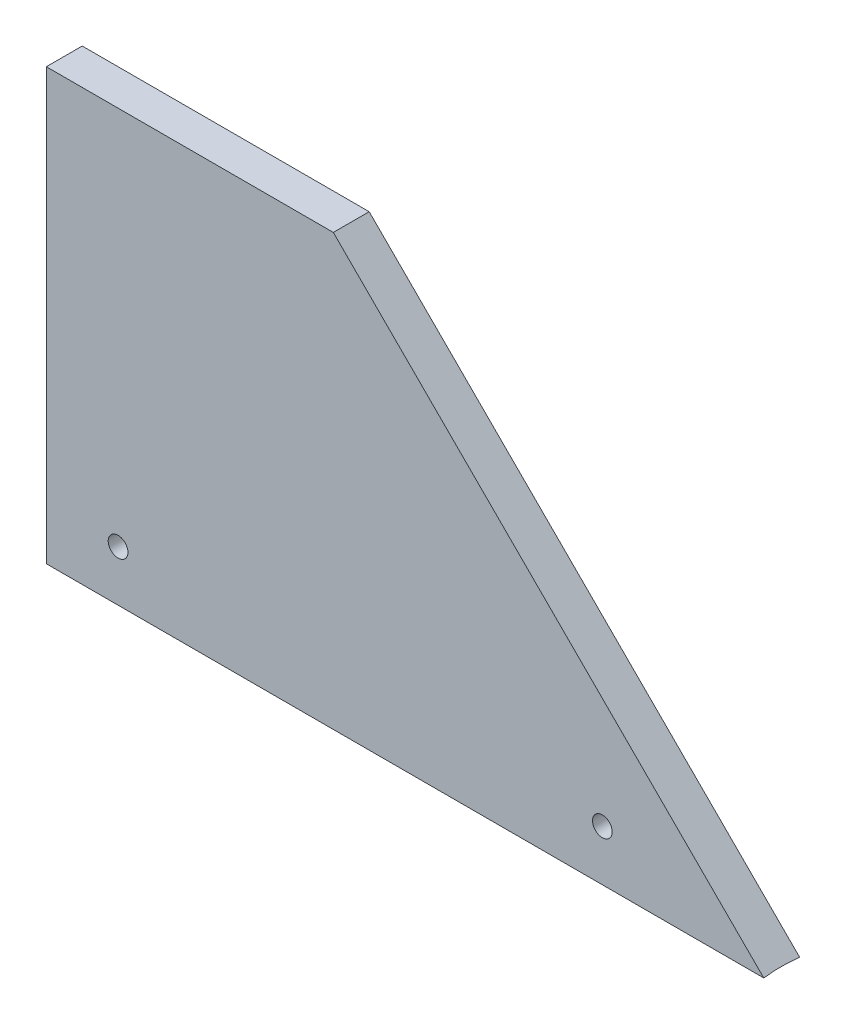
ISO-10303-21;
HEADER;
FILE_DESCRIPTION(('STEP AP214'),'2;1');
FILE_NAME('part.step','',(''),(''),'','','');
FILE_SCHEMA(('AUTOMOTIVE_DESIGN { 1 0 10303 214 1 1 1 1 }'));
ENDSEC;
DATA;
#1=APPLICATION_CONTEXT('core data for automotive mechanical design processes');
#2=APPLICATION_PROTOCOL_DEFINITION('international standard','automotive_design',2000,#1);
#3=PRODUCT_CONTEXT('',#1,'mechanical');
#4=PRODUCT('Part','Part','',(#3));
#5=PRODUCT_RELATED_PRODUCT_CATEGORY('part','',(#4));
#6=PRODUCT_DEFINITION_FORMATION('','',#4);
#7=PRODUCT_DEFINITION_CONTEXT('part definition',#1,'design');
#8=PRODUCT_DEFINITION('design','',#6,#7);
#9=PRODUCT_DEFINITION_SHAPE('','',#8);
#10=(LENGTH_UNIT() NAMED_UNIT(*) SI_UNIT(.MILLI.,.METRE.));
#11=(NAMED_UNIT(*) PLANE_ANGLE_UNIT() SI_UNIT($,.RADIAN.));
#12=(NAMED_UNIT(*) SI_UNIT($,.STERADIAN.) SOLID_ANGLE_UNIT());
#13=UNCERTAINTY_MEASURE_WITH_UNIT(LENGTH_MEASURE(1.E-05),#10,'distance_accuracy_value','');
#14=(GEOMETRIC_REPRESENTATION_CONTEXT(3) GLOBAL_UNCERTAINTY_ASSIGNED_CONTEXT((#13)) GLOBAL_UNIT_ASSIGNED_CONTEXT((#10,
#11,#12)) REPRESENTATION_CONTEXT('',''));
#15=CARTESIAN_POINT('',(0.,0.,0.));
#16=DIRECTION('',(0.,0.,1.));
#17=DIRECTION('',(1.,0.,0.));
#18=AXIS2_PLACEMENT_3D('',#15,#16,#17);
#19=CARTESIAN_POINT('',(80.,120.,10.));
#20=DIRECTION('',(-0.707106781186547,-0.707106781186548,0.));
#21=DIRECTION('',(0.707106781186548,-0.707106781186547,0.));
#22=AXIS2_PLACEMENT_3D('',#19,#20,#21);
#23=PLANE('',#22);
#24=CARTESIAN_POINT('',(276.035781050766,-76.0357810507658,5.));
#25=DIRECTION('',(-0.707106781186547,-0.707106781186548,0.));
#26=DIRECTION('',(0.707106781186548,-0.707106781186547,0.));
#27=AXIS2_PLACEMENT_3D('',#24,#25,#26);
#28=ELLIPSE('',#27,107.76307345283,76.2);
#29=CARTESIAN_POINT('',(200.,0.,0.));
#30=VERTEX_POINT('',#29);
#31=CARTESIAN_POINT('',(200.,0.,10.));
#32=VERTEX_POINT('',#31);
#33=EDGE_CURVE('E87',#30,#32,#28,.F.);
#34=ORIENTED_EDGE('',*,*,#33,.F.);
#35=DIRECTION('',(-0.707106781186547,0.707106781186547,0.));
#36=VECTOR('',#35,1.);
#37=CARTESIAN_POINT('',(80.,120.,0.));
#38=LINE('',#37,#36);
#39=CARTESIAN_POINT('',(80.,120.,0.));
#40=VERTEX_POINT('',#39);
#41=EDGE_CURVE('E81',#30,#40,#38,.T.);
#42=ORIENTED_EDGE('',*,*,#41,.T.);
#43=DIRECTION('',(0.,0.,-1.));
#44=VECTOR('',#43,1.);
#45=CARTESIAN_POINT('',(80.,120.,10.));
#46=LINE('',#45,#44);
#47=CARTESIAN_POINT('',(80.,120.,10.));
#48=VERTEX_POINT('',#47);
#49=EDGE_CURVE('E11',#48,#40,#46,.T.);
#50=ORIENTED_EDGE('',*,*,#49,.F.);
#51=DIRECTION('',(-0.707106781186547,0.707106781186547,0.));
#52=VECTOR('',#51,1.);
#53=CARTESIAN_POINT('',(80.,120.,10.));
#54=LINE('',#53,#52);
#55=EDGE_CURVE('E76',#32,#48,#54,.T.);
#56=ORIENTED_EDGE('',*,*,#55,.F.);
#57=EDGE_LOOP('',(#34,#42,#50,#56));
#58=FACE_BOUND('',#57,.T.);
#59=ADVANCED_FACE('F33',(#58),#23,.F.);
#60=CARTESIAN_POINT('',(0.,0.,10.));
#61=DIRECTION('',(1.,0.,0.));
#62=DIRECTION('',(0.,0.,-1.));
#63=AXIS2_PLACEMENT_3D('',#60,#61,#62);
#64=PLANE('',#63);
#65=CARTESIAN_POINT('',(0.,-76.0357810507658,5.));
#66=DIRECTION('',(1.,0.,0.));
#67=DIRECTION('',(0.,0.,-1.));
#68=AXIS2_PLACEMENT_3D('',#65,#66,#67);
#69=CIRCLE('',#68,76.2);
#70=CARTESIAN_POINT('',(0.,0.,10.));
#71=VERTEX_POINT('',#70);
#72=CARTESIAN_POINT('',(0.,0.,0.));
#73=VERTEX_POINT('',#72);
#74=EDGE_CURVE('E49',#71,#73,#69,.F.);
#75=ORIENTED_EDGE('',*,*,#74,.F.);
#76=DIRECTION('',(0.,-1.,0.));
#77=VECTOR('',#76,1.);
#78=CARTESIAN_POINT('',(0.,0.,10.));
#79=LINE('',#78,#77);
#80=CARTESIAN_POINT('',(0.,120.,10.));
#81=VERTEX_POINT('',#80);
#82=EDGE_CURVE('E94',#81,#71,#79,.T.);
#83=ORIENTED_EDGE('',*,*,#82,.F.);
#84=DIRECTION('',(0.,0.,-1.));
#85=VECTOR('',#84,1.);
#86=CARTESIAN_POINT('',(0.,120.,10.));
#87=LINE('',#86,#85);
#88=CARTESIAN_POINT('',(0.,120.,0.));
#89=VERTEX_POINT('',#88);
#90=EDGE_CURVE('E41',#81,#89,#87,.T.);
#91=ORIENTED_EDGE('',*,*,#90,.T.);
#92=DIRECTION('',(0.,-1.,0.));
#93=VECTOR('',#92,1.);
#94=CARTESIAN_POINT('',(0.,0.,0.));
#95=LINE('',#94,#93);
#96=EDGE_CURVE('E68',#89,#73,#95,.T.);
#97=ORIENTED_EDGE('',*,*,#96,.T.);
#98=EDGE_LOOP('',(#75,#83,#91,#97));
#99=FACE_BOUND('',#98,.T.);
#100=ADVANCED_FACE('F127',(#99),#64,.F.);
#101=CARTESIAN_POINT('',(0.,120.,10.));
#102=DIRECTION('',(0.,-1.,0.));
#103=DIRECTION('',(0.,0.,-1.));
#104=AXIS2_PLACEMENT_3D('',#101,#102,#103);
#105=PLANE('',#104);
#106=DIRECTION('',(-1.,0.,0.));
#107=VECTOR('',#106,1.);
#108=CARTESIAN_POINT('',(0.,120.,0.));
#109=LINE('',#108,#107);
#110=EDGE_CURVE('E64',#40,#89,#109,.T.);
#111=ORIENTED_EDGE('',*,*,#110,.T.);
#112=ORIENTED_EDGE('',*,*,#90,.F.);
#113=DIRECTION('',(-1.,0.,0.));
#114=VECTOR('',#113,1.);
#115=CARTESIAN_POINT('',(0.,120.,10.));
#116=LINE('',#115,#114);
#117=EDGE_CURVE('E99',#48,#81,#116,.T.);
#118=ORIENTED_EDGE('',*,*,#117,.F.);
#119=ORIENTED_EDGE('',*,*,#49,.T.);
#120=EDGE_LOOP('',(#111,#112,#118,#119));
#121=FACE_BOUND('',#120,.T.);
#122=ADVANCED_FACE('F124',(#121),#105,.F.);
#123=CARTESIAN_POINT('',(0.,0.,10.));
#124=DIRECTION('',(0.,0.,-1.));
#125=DIRECTION('',(-1.,0.,0.));
#126=AXIS2_PLACEMENT_3D('',#123,#124,#125);
#127=PLANE('',#126);
#128=CARTESIAN_POINT('',(155.,14.1238080805546,10.));
#129=DIRECTION('',(0.,0.,1.));
#130=DIRECTION('',(1.,0.,0.));
#131=AXIS2_PLACEMENT_3D('',#128,#129,#130);
#132=CIRCLE('',#131,2.75);
#133=CARTESIAN_POINT('',(157.75,14.1238080805546,10.));
#134=VERTEX_POINT('',#133);
#135=EDGE_CURVE('E115',#134,#134,#132,.T.);
#136=ORIENTED_EDGE('',*,*,#135,.F.);
#137=EDGE_LOOP('',(#136));
#138=FACE_BOUND('',#137,.T.);
#139=CARTESIAN_POINT('',(20.,14.1238080805546,10.));
#140=DIRECTION('',(0.,0.,1.));
#141=DIRECTION('',(1.,0.,0.));
#142=AXIS2_PLACEMENT_3D('',#139,#140,#141);
#143=CIRCLE('',#142,2.74999999999999);
#144=CARTESIAN_POINT('',(22.75,14.1238080805546,10.));
#145=VERTEX_POINT('',#144);
#146=EDGE_CURVE('E109',#145,#145,#143,.T.);
#147=ORIENTED_EDGE('',*,*,#146,.F.);
#148=EDGE_LOOP('',(#147));
#149=FACE_BOUND('',#148,.T.);
#150=DIRECTION('',(1.,0.,0.));
#151=VECTOR('',#150,1.);
#152=CARTESIAN_POINT('',(200.,0.,10.));
#153=LINE('',#152,#151);
#154=EDGE_CURVE('E98',#71,#32,#153,.T.);
#155=ORIENTED_EDGE('',*,*,#154,.T.);
#156=ORIENTED_EDGE('',*,*,#55,.T.);
#157=ORIENTED_EDGE('',*,*,#117,.T.);
#158=ORIENTED_EDGE('',*,*,#82,.T.);
#159=EDGE_LOOP('',(#155,#156,#157,#158));
#160=FACE_BOUND('',#159,.T.);
#161=ADVANCED_FACE('F121',(#138,#149,#160),#127,.F.);
#162=CARTESIAN_POINT('',(0.,0.,0.));
#163=DIRECTION('',(0.,0.,-1.));
#164=DIRECTION('',(-1.,0.,0.));
#165=AXIS2_PLACEMENT_3D('',#162,#163,#164);
#166=PLANE('',#165);
#167=CARTESIAN_POINT('',(155.,14.1238080805546,0.));
#168=DIRECTION('',(0.,0.,1.));
#169=DIRECTION('',(1.,0.,0.));
#170=AXIS2_PLACEMENT_3D('',#167,#168,#169);
#171=CIRCLE('',#170,2.75);
#172=CARTESIAN_POINT('',(157.75,14.1238080805546,0.));
#173=VERTEX_POINT('',#172);
#174=EDGE_CURVE('E112',#173,#173,#171,.T.);
#175=ORIENTED_EDGE('',*,*,#174,.T.);
#176=EDGE_LOOP('',(#175));
#177=FACE_BOUND('',#176,.T.);
#178=CARTESIAN_POINT('',(20.,14.1238080805546,0.));
#179=DIRECTION('',(0.,0.,1.));
#180=DIRECTION('',(1.,0.,0.));
#181=AXIS2_PLACEMENT_3D('',#178,#179,#180);
#182=CIRCLE('',#181,2.74999999999999);
#183=CARTESIAN_POINT('',(22.75,14.1238080805546,0.));
#184=VERTEX_POINT('',#183);
#185=EDGE_CURVE('E106',#184,#184,#182,.T.);
#186=ORIENTED_EDGE('',*,*,#185,.T.);
#187=EDGE_LOOP('',(#186));
#188=FACE_BOUND('',#187,.T.);
#189=DIRECTION('',(1.,0.,0.));
#190=VECTOR('',#189,1.);
#191=CARTESIAN_POINT('',(200.,0.,0.));
#192=LINE('',#191,#190);
#193=EDGE_CURVE('E84',#73,#30,#192,.T.);
#194=ORIENTED_EDGE('',*,*,#193,.F.);
#195=ORIENTED_EDGE('',*,*,#96,.F.);
#196=ORIENTED_EDGE('',*,*,#110,.F.);
#197=ORIENTED_EDGE('',*,*,#41,.F.);
#198=EDGE_LOOP('',(#194,#195,#196,#197));
#199=FACE_BOUND('',#198,.T.);
#200=ADVANCED_FACE('F82',(#177,#188,#199),#166,.T.);
#201=CARTESIAN_POINT('',(-541.815438248219,-76.0357810507658,5.));
#202=DIRECTION('',(1.,0.,0.));
#203=DIRECTION('',(0.,0.,-1.));
#204=AXIS2_PLACEMENT_3D('',#201,#202,#203);
#205=CYLINDRICAL_SURFACE('',#204,76.2);
#206=ORIENTED_EDGE('',*,*,#193,.T.);
#207=ORIENTED_EDGE('',*,*,#33,.T.);
#208=ORIENTED_EDGE('',*,*,#154,.F.);
#209=ORIENTED_EDGE('',*,*,#74,.T.);
#210=EDGE_LOOP('',(#206,#207,#208,#209));
#211=FACE_BOUND('',#210,.T.);
#212=ADVANCED_FACE('F91',(#211),#205,.F.);
#213=CARTESIAN_POINT('',(20.,14.1238080805546,10.));
#214=DIRECTION('',(0.,0.,1.));
#215=DIRECTION('',(1.,0.,0.));
#216=AXIS2_PLACEMENT_3D('',#213,#214,#215);
#217=CYLINDRICAL_SURFACE('',#216,2.74999999999999);
#218=ORIENTED_EDGE('',*,*,#185,.F.);
#219=EDGE_LOOP('',(#218));
#220=FACE_BOUND('',#219,.T.);
#221=ORIENTED_EDGE('',*,*,#146,.T.);
#222=EDGE_LOOP('',(#221));
#223=FACE_BOUND('',#222,.T.);
#224=ADVANCED_FACE('F140',(#220,#223),#217,.F.);
#225=CARTESIAN_POINT('',(155.,14.1238080805546,10.));
#226=DIRECTION('',(0.,0.,1.));
#227=DIRECTION('',(1.,0.,0.));
#228=AXIS2_PLACEMENT_3D('',#225,#226,#227);
#229=CYLINDRICAL_SURFACE('',#228,2.75);
#230=ORIENTED_EDGE('',*,*,#174,.F.);
#231=EDGE_LOOP('',(#230));
#232=FACE_BOUND('',#231,.T.);
#233=ORIENTED_EDGE('',*,*,#135,.T.);
#234=EDGE_LOOP('',(#233));
#235=FACE_BOUND('',#234,.T.);
#236=ADVANCED_FACE('F119',(#232,#235),#229,.F.);
#237=CLOSED_SHELL('',(#59,#100,#122,#161,#200,#212,#224,#236));
#238=MANIFOLD_SOLID_BREP('B2',#237);
#239=ADVANCED_BREP_SHAPE_REPRESENTATION('',(#18,#238),#14);
#240=SHAPE_DEFINITION_REPRESENTATION(#9,#239);
ENDSEC;
END-ISO-10303-21;
